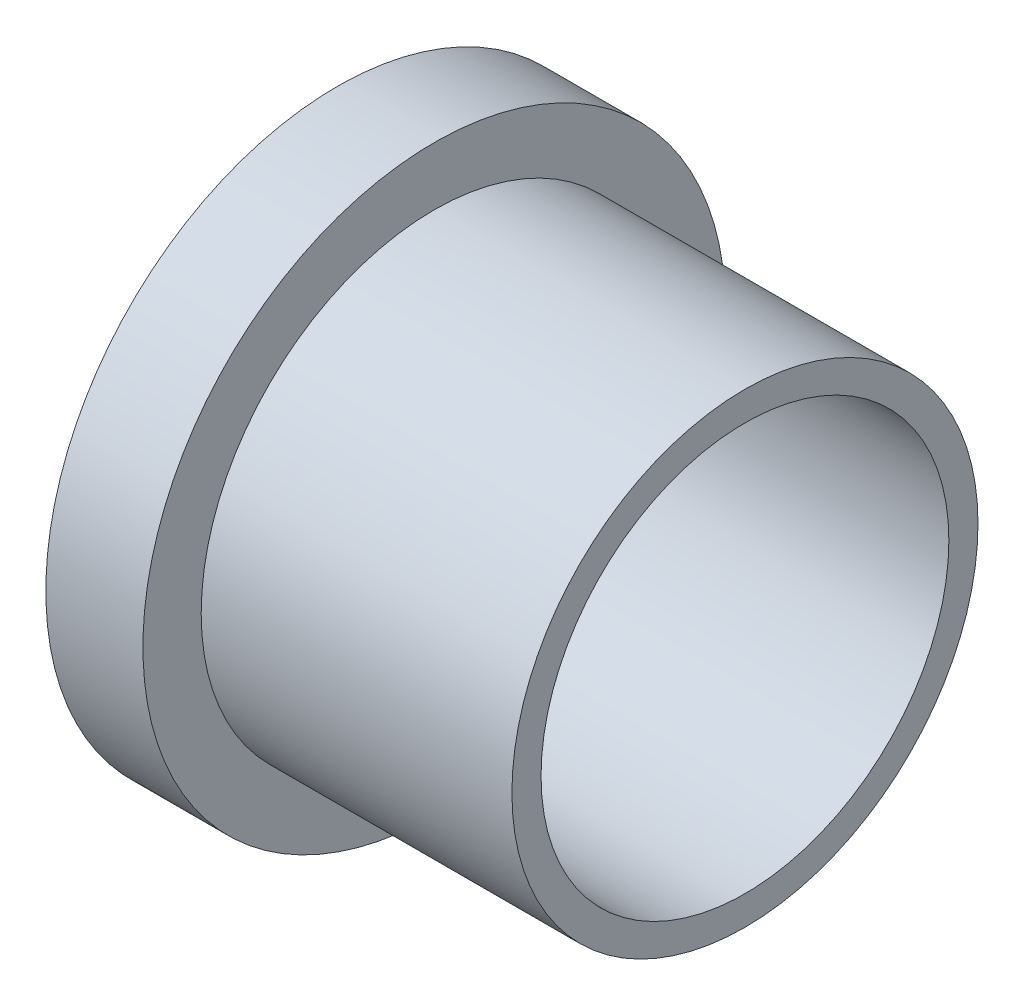
ISO-10303-21;
HEADER;
FILE_DESCRIPTION(('STEP AP214'),'2;1');
FILE_NAME('part.step','',(''),(''),'','','');
FILE_SCHEMA(('AUTOMOTIVE_DESIGN { 1 0 10303 214 1 1 1 1 }'));
ENDSEC;
DATA;
#1=APPLICATION_CONTEXT('core data for automotive mechanical design processes');
#2=APPLICATION_PROTOCOL_DEFINITION('international standard','automotive_design',2000,#1);
#3=PRODUCT_CONTEXT('',#1,'mechanical');
#4=PRODUCT('Part','Part','',(#3));
#5=PRODUCT_RELATED_PRODUCT_CATEGORY('part','',(#4));
#6=PRODUCT_DEFINITION_FORMATION('','',#4);
#7=PRODUCT_DEFINITION_CONTEXT('part definition',#1,'design');
#8=PRODUCT_DEFINITION('design','',#6,#7);
#9=PRODUCT_DEFINITION_SHAPE('','',#8);
#10=(LENGTH_UNIT() NAMED_UNIT(*) SI_UNIT(.MILLI.,.METRE.));
#11=(NAMED_UNIT(*) PLANE_ANGLE_UNIT() SI_UNIT($,.RADIAN.));
#12=(NAMED_UNIT(*) SI_UNIT($,.STERADIAN.) SOLID_ANGLE_UNIT());
#13=UNCERTAINTY_MEASURE_WITH_UNIT(LENGTH_MEASURE(1.E-05),#10,'distance_accuracy_value','');
#14=(GEOMETRIC_REPRESENTATION_CONTEXT(3) GLOBAL_UNCERTAINTY_ASSIGNED_CONTEXT((#13)) GLOBAL_UNIT_ASSIGNED_CONTEXT((#10,
#11,#12)) REPRESENTATION_CONTEXT('',''));
#15=CARTESIAN_POINT('',(0.,0.,0.));
#16=DIRECTION('',(0.,0.,1.));
#17=DIRECTION('',(1.,0.,0.));
#18=AXIS2_PLACEMENT_3D('',#15,#16,#17);
#19=CARTESIAN_POINT('',(2.5,0.,0.));
#20=DIRECTION('',(-1.,0.,0.));
#21=DIRECTION('',(0.,0.,1.));
#22=AXIS2_PLACEMENT_3D('',#19,#20,#21);
#23=CYLINDRICAL_SURFACE('',#22,15.);
#24=CARTESIAN_POINT('',(2.5,0.,0.));
#25=DIRECTION('',(1.,0.,0.));
#26=DIRECTION('',(0.,0.,-1.));
#27=AXIS2_PLACEMENT_3D('',#24,#25,#26);
#28=CIRCLE('',#27,15.);
#29=CARTESIAN_POINT('',(2.5,0.,-15.));
#30=VERTEX_POINT('',#29);
#31=EDGE_CURVE('E42',#30,#30,#28,.T.);
#32=ORIENTED_EDGE('',*,*,#31,.F.);
#33=EDGE_LOOP('',(#32));
#34=FACE_BOUND('',#33,.T.);
#35=CARTESIAN_POINT('',(-2.5,0.,0.));
#36=DIRECTION('',(1.,0.,0.));
#37=DIRECTION('',(0.,0.,-1.));
#38=AXIS2_PLACEMENT_3D('',#35,#36,#37);
#39=CIRCLE('',#38,15.);
#40=CARTESIAN_POINT('',(-2.5,0.,-15.));
#41=VERTEX_POINT('',#40);
#42=EDGE_CURVE('E47',#41,#41,#39,.T.);
#43=ORIENTED_EDGE('',*,*,#42,.T.);
#44=EDGE_LOOP('',(#43));
#45=FACE_BOUND('',#44,.T.);
#46=ADVANCED_FACE('F40',(#34,#45),#23,.T.);
#47=CARTESIAN_POINT('',(2.5,0.,0.));
#48=DIRECTION('',(1.,0.,0.));
#49=DIRECTION('',(0.,0.,-1.));
#50=AXIS2_PLACEMENT_3D('',#47,#48,#49);
#51=PLANE('',#50);
#52=CARTESIAN_POINT('',(2.5,0.,0.));
#53=DIRECTION('',(1.,0.,0.));
#54=DIRECTION('',(0.,0.,-1.));
#55=AXIS2_PLACEMENT_3D('',#52,#53,#54);
#56=CIRCLE('',#55,12.);
#57=CARTESIAN_POINT('',(2.5,0.,-12.));
#58=VERTEX_POINT('',#57);
#59=EDGE_CURVE('E10',#58,#58,#56,.T.);
#60=ORIENTED_EDGE('',*,*,#59,.F.);
#61=EDGE_LOOP('',(#60));
#62=FACE_BOUND('',#61,.T.);
#63=ORIENTED_EDGE('',*,*,#31,.T.);
#64=EDGE_LOOP('',(#63));
#65=FACE_BOUND('',#64,.T.);
#66=ADVANCED_FACE('F84',(#62,#65),#51,.T.);
#67=CARTESIAN_POINT('',(-2.5,0.,0.));
#68=DIRECTION('',(1.,0.,0.));
#69=DIRECTION('',(0.,0.,-1.));
#70=AXIS2_PLACEMENT_3D('',#67,#68,#69);
#71=PLANE('',#70);
#72=CARTESIAN_POINT('',(-2.5,0.,0.));
#73=DIRECTION('',(1.,0.,0.));
#74=DIRECTION('',(0.,0.,-1.));
#75=AXIS2_PLACEMENT_3D('',#72,#73,#74);
#76=CIRCLE('',#75,10.5);
#77=CARTESIAN_POINT('',(-2.5,0.,-10.5));
#78=VERTEX_POINT('',#77);
#79=EDGE_CURVE('E37',#78,#78,#76,.T.);
#80=ORIENTED_EDGE('',*,*,#79,.T.);
#81=EDGE_LOOP('',(#80));
#82=FACE_BOUND('',#81,.T.);
#83=ORIENTED_EDGE('',*,*,#42,.F.);
#84=EDGE_LOOP('',(#83));
#85=FACE_BOUND('',#84,.T.);
#86=ADVANCED_FACE('F70',(#82,#85),#71,.F.);
#87=CARTESIAN_POINT('',(18.5,0.,0.));
#88=DIRECTION('',(1.,0.,0.));
#89=DIRECTION('',(0.,0.,-1.));
#90=AXIS2_PLACEMENT_3D('',#87,#88,#89);
#91=PLANE('',#90);
#92=CARTESIAN_POINT('',(18.5,0.,0.));
#93=DIRECTION('',(1.,0.,0.));
#94=DIRECTION('',(0.,0.,-1.));
#95=AXIS2_PLACEMENT_3D('',#92,#93,#94);
#96=CIRCLE('',#95,12.);
#97=CARTESIAN_POINT('',(18.5,0.,-12.));
#98=VERTEX_POINT('',#97);
#99=EDGE_CURVE('E55',#98,#98,#96,.T.);
#100=ORIENTED_EDGE('',*,*,#99,.T.);
#101=EDGE_LOOP('',(#100));
#102=FACE_BOUND('',#101,.T.);
#103=CARTESIAN_POINT('',(18.5,0.,0.));
#104=DIRECTION('',(1.,0.,0.));
#105=DIRECTION('',(0.,0.,-1.));
#106=AXIS2_PLACEMENT_3D('',#103,#104,#105);
#107=CIRCLE('',#106,10.5);
#108=CARTESIAN_POINT('',(18.5,0.,-10.5));
#109=VERTEX_POINT('',#108);
#110=EDGE_CURVE('E59',#109,#109,#107,.T.);
#111=ORIENTED_EDGE('',*,*,#110,.F.);
#112=EDGE_LOOP('',(#111));
#113=FACE_BOUND('',#112,.T.);
#114=ADVANCED_FACE('F79',(#102,#113),#91,.T.);
#115=CARTESIAN_POINT('',(18.5,0.,0.));
#116=DIRECTION('',(-1.,0.,0.));
#117=DIRECTION('',(0.,0.,1.));
#118=AXIS2_PLACEMENT_3D('',#115,#116,#117);
#119=CYLINDRICAL_SURFACE('',#118,12.);
#120=ORIENTED_EDGE('',*,*,#99,.F.);
#121=EDGE_LOOP('',(#120));
#122=FACE_BOUND('',#121,.T.);
#123=ORIENTED_EDGE('',*,*,#59,.T.);
#124=EDGE_LOOP('',(#123));
#125=FACE_BOUND('',#124,.T.);
#126=ADVANCED_FACE('F75',(#122,#125),#119,.T.);
#127=CARTESIAN_POINT('',(18.5,0.,0.));
#128=DIRECTION('',(-1.,0.,0.));
#129=DIRECTION('',(0.,0.,1.));
#130=AXIS2_PLACEMENT_3D('',#127,#128,#129);
#131=CYLINDRICAL_SURFACE('',#130,10.5);
#132=ORIENTED_EDGE('',*,*,#110,.T.);
#133=EDGE_LOOP('',(#132));
#134=FACE_BOUND('',#133,.T.);
#135=ORIENTED_EDGE('',*,*,#79,.F.);
#136=EDGE_LOOP('',(#135));
#137=FACE_BOUND('',#136,.T.);
#138=ADVANCED_FACE('F68',(#134,#137),#131,.F.);
#139=CLOSED_SHELL('',(#46,#66,#86,#114,#126,#138));
#140=MANIFOLD_SOLID_BREP('B2',#139);
#141=ADVANCED_BREP_SHAPE_REPRESENTATION('',(#18,#140),#14);
#142=SHAPE_DEFINITION_REPRESENTATION(#9,#141);
ENDSEC;
END-ISO-10303-21;
